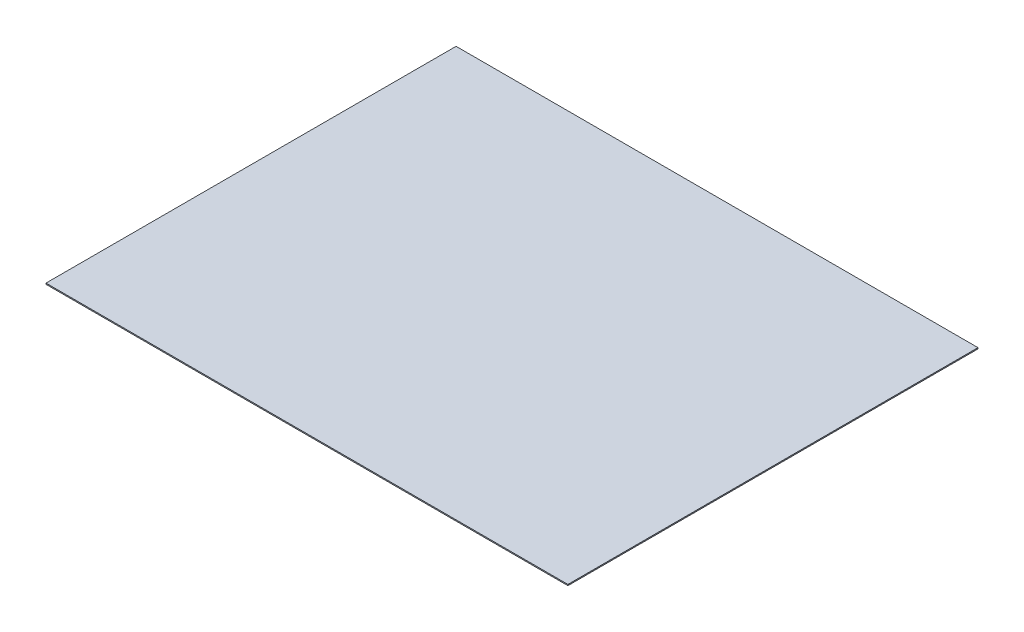
ISO-10303-21;
HEADER;
FILE_DESCRIPTION(('STEP AP214'),'2;1');
FILE_NAME('part.step','',(''),(''),'','','');
FILE_SCHEMA(('AUTOMOTIVE_DESIGN { 1 0 10303 214 1 1 1 1 }'));
ENDSEC;
DATA;
#1=APPLICATION_CONTEXT('core data for automotive mechanical design processes');
#2=APPLICATION_PROTOCOL_DEFINITION('international standard','automotive_design',2000,#1);
#3=PRODUCT_CONTEXT('',#1,'mechanical');
#4=PRODUCT('Part','Part','',(#3));
#5=PRODUCT_RELATED_PRODUCT_CATEGORY('part','',(#4));
#6=PRODUCT_DEFINITION_FORMATION('','',#4);
#7=PRODUCT_DEFINITION_CONTEXT('part definition',#1,'design');
#8=PRODUCT_DEFINITION('design','',#6,#7);
#9=PRODUCT_DEFINITION_SHAPE('','',#8);
#10=(LENGTH_UNIT() NAMED_UNIT(*) SI_UNIT(.MILLI.,.METRE.));
#11=(NAMED_UNIT(*) PLANE_ANGLE_UNIT() SI_UNIT($,.RADIAN.));
#12=(NAMED_UNIT(*) SI_UNIT($,.STERADIAN.) SOLID_ANGLE_UNIT());
#13=UNCERTAINTY_MEASURE_WITH_UNIT(LENGTH_MEASURE(1.E-05),#10,'distance_accuracy_value','');
#14=(GEOMETRIC_REPRESENTATION_CONTEXT(3) GLOBAL_UNCERTAINTY_ASSIGNED_CONTEXT((#13)) GLOBAL_UNIT_ASSIGNED_CONTEXT((#10,
#11,#12)) REPRESENTATION_CONTEXT('',''));
#15=CARTESIAN_POINT('',(0.,0.,0.));
#16=DIRECTION('',(0.,0.,1.));
#17=DIRECTION('',(1.,0.,0.));
#18=AXIS2_PLACEMENT_3D('',#15,#16,#17);
#19=CARTESIAN_POINT('',(-350.,1.5,275.));
#20=DIRECTION('',(1.,0.,0.));
#21=DIRECTION('',(0.,0.,-1.));
#22=AXIS2_PLACEMENT_3D('',#19,#20,#21);
#23=PLANE('',#22);
#24=DIRECTION('',(0.,0.,1.));
#25=VECTOR('',#24,1.);
#26=CARTESIAN_POINT('',(-350.,0.,275.));
#27=LINE('',#26,#25);
#28=CARTESIAN_POINT('',(-350.,0.,-275.));
#29=VERTEX_POINT('',#28);
#30=CARTESIAN_POINT('',(-350.,0.,275.));
#31=VERTEX_POINT('',#30);
#32=EDGE_CURVE('E108',#29,#31,#27,.T.);
#33=ORIENTED_EDGE('',*,*,#32,.T.);
#34=DIRECTION('',(0.,-1.,0.));
#35=VECTOR('',#34,1.);
#36=CARTESIAN_POINT('',(-350.,1.5,275.));
#37=LINE('',#36,#35);
#38=CARTESIAN_POINT('',(-350.,1.5,275.));
#39=VERTEX_POINT('',#38);
#40=EDGE_CURVE('E11',#39,#31,#37,.T.);
#41=ORIENTED_EDGE('',*,*,#40,.F.);
#42=DIRECTION('',(0.,0.,1.));
#43=VECTOR('',#42,1.);
#44=CARTESIAN_POINT('',(-350.,1.5,275.));
#45=LINE('',#44,#43);
#46=CARTESIAN_POINT('',(-350.,1.5,-275.));
#47=VERTEX_POINT('',#46);
#48=EDGE_CURVE('E92',#47,#39,#45,.T.);
#49=ORIENTED_EDGE('',*,*,#48,.F.);
#50=DIRECTION('',(0.,-1.,0.));
#51=VECTOR('',#50,1.);
#52=CARTESIAN_POINT('',(-350.,1.5,-275.));
#53=LINE('',#52,#51);
#54=EDGE_CURVE('E104',#47,#29,#53,.T.);
#55=ORIENTED_EDGE('',*,*,#54,.T.);
#56=EDGE_LOOP('',(#33,#41,#49,#55));
#57=FACE_BOUND('',#56,.T.);
#58=ADVANCED_FACE('F40',(#57),#23,.F.);
#59=CARTESIAN_POINT('',(350.,1.5,275.));
#60=DIRECTION('',(0.,0.,-1.));
#61=DIRECTION('',(-1.,0.,0.));
#62=AXIS2_PLACEMENT_3D('',#59,#60,#61);
#63=PLANE('',#62);
#64=DIRECTION('',(1.,0.,0.));
#65=VECTOR('',#64,1.);
#66=CARTESIAN_POINT('',(350.,0.,275.));
#67=LINE('',#66,#65);
#68=CARTESIAN_POINT('',(350.,0.,275.));
#69=VERTEX_POINT('',#68);
#70=EDGE_CURVE('E97',#31,#69,#67,.T.);
#71=ORIENTED_EDGE('',*,*,#70,.T.);
#72=DIRECTION('',(0.,-1.,0.));
#73=VECTOR('',#72,1.);
#74=CARTESIAN_POINT('',(350.,1.5,275.));
#75=LINE('',#74,#73);
#76=CARTESIAN_POINT('',(350.,1.5,275.));
#77=VERTEX_POINT('',#76);
#78=EDGE_CURVE('E49',#77,#69,#75,.T.);
#79=ORIENTED_EDGE('',*,*,#78,.F.);
#80=DIRECTION('',(1.,0.,0.));
#81=VECTOR('',#80,1.);
#82=CARTESIAN_POINT('',(350.,1.5,275.));
#83=LINE('',#82,#81);
#84=EDGE_CURVE('E87',#39,#77,#83,.T.);
#85=ORIENTED_EDGE('',*,*,#84,.F.);
#86=ORIENTED_EDGE('',*,*,#40,.T.);
#87=EDGE_LOOP('',(#71,#79,#85,#86));
#88=FACE_BOUND('',#87,.T.);
#89=ADVANCED_FACE('F96',(#88),#63,.F.);
#90=CARTESIAN_POINT('',(350.,1.5,275.));
#91=DIRECTION('',(-1.,0.,0.));
#92=DIRECTION('',(0.,0.,1.));
#93=AXIS2_PLACEMENT_3D('',#90,#91,#92);
#94=PLANE('',#93);
#95=DIRECTION('',(0.,0.,-1.));
#96=VECTOR('',#95,1.);
#97=CARTESIAN_POINT('',(350.,0.,275.));
#98=LINE('',#97,#96);
#99=CARTESIAN_POINT('',(350.,0.,-275.));
#100=VERTEX_POINT('',#99);
#101=EDGE_CURVE('E74',#69,#100,#98,.T.);
#102=ORIENTED_EDGE('',*,*,#101,.T.);
#103=DIRECTION('',(0.,-1.,0.));
#104=VECTOR('',#103,1.);
#105=CARTESIAN_POINT('',(350.,1.5,-275.));
#106=LINE('',#105,#104);
#107=CARTESIAN_POINT('',(350.,1.5,-275.));
#108=VERTEX_POINT('',#107);
#109=EDGE_CURVE('E99',#108,#100,#106,.T.);
#110=ORIENTED_EDGE('',*,*,#109,.F.);
#111=DIRECTION('',(0.,0.,-1.));
#112=VECTOR('',#111,1.);
#113=CARTESIAN_POINT('',(350.,1.5,275.));
#114=LINE('',#113,#112);
#115=EDGE_CURVE('E90',#77,#108,#114,.T.);
#116=ORIENTED_EDGE('',*,*,#115,.F.);
#117=ORIENTED_EDGE('',*,*,#78,.T.);
#118=EDGE_LOOP('',(#102,#110,#116,#117));
#119=FACE_BOUND('',#118,.T.);
#120=ADVANCED_FACE('F100',(#119),#94,.F.);
#121=CARTESIAN_POINT('',(350.,1.5,-275.));
#122=DIRECTION('',(0.,0.,1.));
#123=DIRECTION('',(1.,0.,0.));
#124=AXIS2_PLACEMENT_3D('',#121,#122,#123);
#125=PLANE('',#124);
#126=DIRECTION('',(-1.,0.,0.));
#127=VECTOR('',#126,1.);
#128=CARTESIAN_POINT('',(350.,0.,-275.));
#129=LINE('',#128,#127);
#130=EDGE_CURVE('E80',#100,#29,#129,.T.);
#131=ORIENTED_EDGE('',*,*,#130,.T.);
#132=ORIENTED_EDGE('',*,*,#54,.F.);
#133=DIRECTION('',(-1.,0.,0.));
#134=VECTOR('',#133,1.);
#135=CARTESIAN_POINT('',(350.,1.5,-275.));
#136=LINE('',#135,#134);
#137=EDGE_CURVE('E57',#108,#47,#136,.T.);
#138=ORIENTED_EDGE('',*,*,#137,.F.);
#139=ORIENTED_EDGE('',*,*,#109,.T.);
#140=EDGE_LOOP('',(#131,#132,#138,#139));
#141=FACE_BOUND('',#140,.T.);
#142=ADVANCED_FACE('F121',(#141),#125,.F.);
#143=CARTESIAN_POINT('',(0.,1.5,0.));
#144=DIRECTION('',(0.,1.,0.));
#145=DIRECTION('',(0.,0.,1.));
#146=AXIS2_PLACEMENT_3D('',#143,#144,#145);
#147=PLANE('',#146);
#148=ORIENTED_EDGE('',*,*,#48,.T.);
#149=ORIENTED_EDGE('',*,*,#84,.T.);
#150=ORIENTED_EDGE('',*,*,#115,.T.);
#151=ORIENTED_EDGE('',*,*,#137,.T.);
#152=EDGE_LOOP('',(#148,#149,#150,#151));
#153=FACE_BOUND('',#152,.T.);
#154=ADVANCED_FACE('F88',(#153),#147,.T.);
#155=CARTESIAN_POINT('',(0.,0.,0.));
#156=DIRECTION('',(0.,1.,0.));
#157=DIRECTION('',(0.,0.,1.));
#158=AXIS2_PLACEMENT_3D('',#155,#156,#157);
#159=PLANE('',#158);
#160=ORIENTED_EDGE('',*,*,#32,.F.);
#161=ORIENTED_EDGE('',*,*,#130,.F.);
#162=ORIENTED_EDGE('',*,*,#101,.F.);
#163=ORIENTED_EDGE('',*,*,#70,.F.);
#164=EDGE_LOOP('',(#160,#161,#162,#163));
#165=FACE_BOUND('',#164,.T.);
#166=ADVANCED_FACE('F124',(#165),#159,.F.);
#167=CLOSED_SHELL('',(#58,#89,#120,#142,#154,#166));
#168=MANIFOLD_SOLID_BREP('B2',#167);
#169=ADVANCED_BREP_SHAPE_REPRESENTATION('',(#18,#168),#14);
#170=SHAPE_DEFINITION_REPRESENTATION(#9,#169);
ENDSEC;
END-ISO-10303-21;
